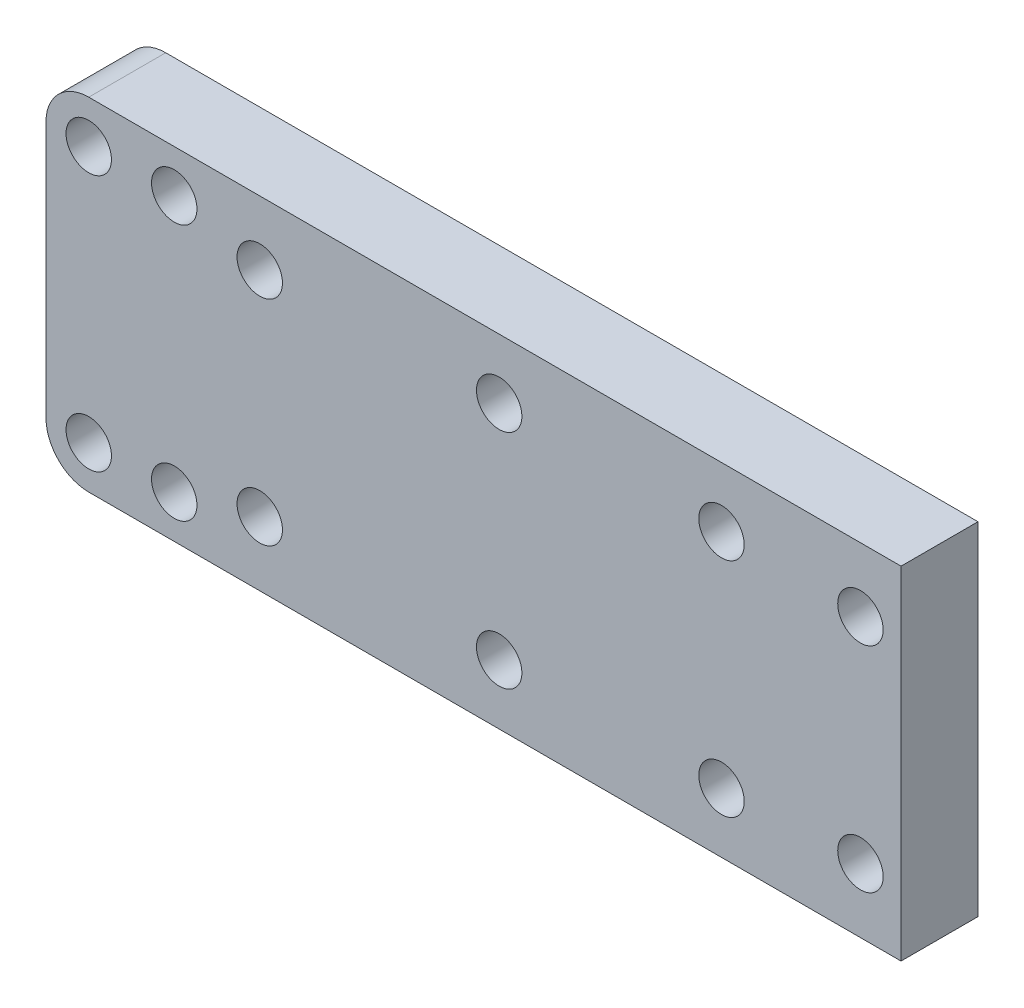
ISO-10303-21;
HEADER;
FILE_DESCRIPTION(('STEP AP214'),'2;1');
FILE_NAME('part.step','',(''),(''),'','','');
FILE_SCHEMA(('AUTOMOTIVE_DESIGN { 1 0 10303 214 1 1 1 1 }'));
ENDSEC;
DATA;
#1=APPLICATION_CONTEXT('core data for automotive mechanical design processes');
#2=APPLICATION_PROTOCOL_DEFINITION('international standard','automotive_design',2000,#1);
#3=PRODUCT_CONTEXT('',#1,'mechanical');
#4=PRODUCT('Part','Part','',(#3));
#5=PRODUCT_RELATED_PRODUCT_CATEGORY('part','',(#4));
#6=PRODUCT_DEFINITION_FORMATION('','',#4);
#7=PRODUCT_DEFINITION_CONTEXT('part definition',#1,'design');
#8=PRODUCT_DEFINITION('design','',#6,#7);
#9=PRODUCT_DEFINITION_SHAPE('','',#8);
#10=(LENGTH_UNIT() NAMED_UNIT(*) SI_UNIT(.MILLI.,.METRE.));
#11=(NAMED_UNIT(*) PLANE_ANGLE_UNIT() SI_UNIT($,.RADIAN.));
#12=(NAMED_UNIT(*) SI_UNIT($,.STERADIAN.) SOLID_ANGLE_UNIT());
#13=UNCERTAINTY_MEASURE_WITH_UNIT(LENGTH_MEASURE(1.E-05),#10,'distance_accuracy_value','');
#14=(GEOMETRIC_REPRESENTATION_CONTEXT(3) GLOBAL_UNCERTAINTY_ASSIGNED_CONTEXT((#13)) GLOBAL_UNIT_ASSIGNED_CONTEXT((#10,
#11,#12)) REPRESENTATION_CONTEXT('',''));
#15=CARTESIAN_POINT('',(0.,0.,0.));
#16=DIRECTION('',(0.,0.,1.));
#17=DIRECTION('',(1.,0.,0.));
#18=AXIS2_PLACEMENT_3D('',#15,#16,#17);
#19=CARTESIAN_POINT('',(-48.1165755919854,24.4284153005464,11.43));
#20=DIRECTION('',(1.,0.,0.));
#21=DIRECTION('',(0.,0.,-1.));
#22=AXIS2_PLACEMENT_3D('',#19,#20,#21);
#23=PLANE('',#22);
#24=DIRECTION('',(0.,-1.,0.));
#25=VECTOR('',#24,1.);
#26=CARTESIAN_POINT('',(-48.1165755919854,24.4284153005464,0.));
#27=LINE('',#26,#25);
#28=CARTESIAN_POINT('',(-48.1165755919854,18.0784153005464,0.));
#29=VERTEX_POINT('',#28);
#30=CARTESIAN_POINT('',(-48.1165755919854,-20.0215846994536,0.));
#31=VERTEX_POINT('',#30);
#32=EDGE_CURVE('E120',#29,#31,#27,.T.);
#33=ORIENTED_EDGE('',*,*,#32,.T.);
#34=DIRECTION('',(0.,0.,-1.));
#35=VECTOR('',#34,1.);
#36=CARTESIAN_POINT('',(-48.1165755919854,-20.0215846994536,11.43));
#37=LINE('',#36,#35);
#38=CARTESIAN_POINT('',(-48.1165755919854,-20.0215846994536,11.43));
#39=VERTEX_POINT('',#38);
#40=EDGE_CURVE('E58',#31,#39,#37,.F.);
#41=ORIENTED_EDGE('',*,*,#40,.T.);
#42=DIRECTION('',(0.,-1.,0.));
#43=VECTOR('',#42,1.);
#44=CARTESIAN_POINT('',(-48.1165755919854,24.4284153005464,11.43));
#45=LINE('',#44,#43);
#46=CARTESIAN_POINT('',(-48.1165755919854,18.0784153005464,11.43));
#47=VERTEX_POINT('',#46);
#48=EDGE_CURVE('E101',#47,#39,#45,.T.);
#49=ORIENTED_EDGE('',*,*,#48,.F.);
#50=DIRECTION('',(0.,0.,-1.));
#51=VECTOR('',#50,1.);
#52=CARTESIAN_POINT('',(-48.1165755919854,18.0784153005464,11.43));
#53=LINE('',#52,#51);
#54=EDGE_CURVE('E134',#47,#29,#53,.T.);
#55=ORIENTED_EDGE('',*,*,#54,.T.);
#56=EDGE_LOOP('',(#33,#41,#49,#55));
#57=FACE_BOUND('',#56,.T.);
#58=ADVANCED_FACE('F37',(#57),#23,.F.);
#59=CARTESIAN_POINT('',(-48.1165755919854,-26.3715846994536,11.43));
#60=DIRECTION('',(0.,1.,0.));
#61=DIRECTION('',(0.,0.,1.));
#62=AXIS2_PLACEMENT_3D('',#59,#60,#61);
#63=PLANE('',#62);
#64=DIRECTION('',(1.,0.,0.));
#65=VECTOR('',#64,1.);
#66=CARTESIAN_POINT('',(-48.1165755919854,-26.3715846994536,11.43));
#67=LINE('',#66,#65);
#68=CARTESIAN_POINT('',(-41.7665755919854,-26.3715846994536,11.43));
#69=VERTEX_POINT('',#68);
#70=CARTESIAN_POINT('',(78.8834244080146,-26.3715846994536,11.43));
#71=VERTEX_POINT('',#70);
#72=EDGE_CURVE('E91',#69,#71,#67,.T.);
#73=ORIENTED_EDGE('',*,*,#72,.F.);
#74=DIRECTION('',(0.,0.,-1.));
#75=VECTOR('',#74,1.);
#76=CARTESIAN_POINT('',(-41.7665755919854,-26.3715846994536,11.43));
#77=LINE('',#76,#75);
#78=CARTESIAN_POINT('',(-41.7665755919854,-26.3715846994536,0.));
#79=VERTEX_POINT('',#78);
#80=EDGE_CURVE('E110',#69,#79,#77,.T.);
#81=ORIENTED_EDGE('',*,*,#80,.T.);
#82=DIRECTION('',(1.,0.,0.));
#83=VECTOR('',#82,1.);
#84=CARTESIAN_POINT('',(-48.1165755919854,-26.3715846994536,0.));
#85=LINE('',#84,#83);
#86=CARTESIAN_POINT('',(78.8834244080146,-26.3715846994536,0.));
#87=VERTEX_POINT('',#86);
#88=EDGE_CURVE('E107',#79,#87,#85,.T.);
#89=ORIENTED_EDGE('',*,*,#88,.T.);
#90=DIRECTION('',(0.,0.,-1.));
#91=VECTOR('',#90,1.);
#92=CARTESIAN_POINT('',(78.8834244080146,-26.3715846994536,11.43));
#93=LINE('',#92,#91);
#94=EDGE_CURVE('E104',#71,#87,#93,.T.);
#95=ORIENTED_EDGE('',*,*,#94,.F.);
#96=EDGE_LOOP('',(#73,#81,#89,#95));
#97=FACE_BOUND('',#96,.T.);
#98=ADVANCED_FACE('F105',(#97),#63,.F.);
#99=CARTESIAN_POINT('',(78.8834244080146,24.4284153005464,11.43));
#100=DIRECTION('',(-1.,0.,0.));
#101=DIRECTION('',(0.,0.,1.));
#102=AXIS2_PLACEMENT_3D('',#99,#100,#101);
#103=PLANE('',#102);
#104=DIRECTION('',(0.,1.,0.));
#105=VECTOR('',#104,1.);
#106=CARTESIAN_POINT('',(78.8834244080146,24.4284153005464,0.));
#107=LINE('',#106,#105);
#108=CARTESIAN_POINT('',(78.8834244080146,24.4284153005464,0.));
#109=VERTEX_POINT('',#108);
#110=EDGE_CURVE('E124',#87,#109,#107,.T.);
#111=ORIENTED_EDGE('',*,*,#110,.T.);
#112=DIRECTION('',(0.,0.,-1.));
#113=VECTOR('',#112,1.);
#114=CARTESIAN_POINT('',(78.8834244080146,24.4284153005464,11.43));
#115=LINE('',#114,#113);
#116=CARTESIAN_POINT('',(78.8834244080146,24.4284153005464,11.43));
#117=VERTEX_POINT('',#116);
#118=EDGE_CURVE('E111',#117,#109,#115,.T.);
#119=ORIENTED_EDGE('',*,*,#118,.F.);
#120=DIRECTION('',(0.,1.,0.));
#121=VECTOR('',#120,1.);
#122=CARTESIAN_POINT('',(78.8834244080146,24.4284153005464,11.43));
#123=LINE('',#122,#121);
#124=EDGE_CURVE('E95',#71,#117,#123,.T.);
#125=ORIENTED_EDGE('',*,*,#124,.F.);
#126=ORIENTED_EDGE('',*,*,#94,.T.);
#127=EDGE_LOOP('',(#111,#119,#125,#126));
#128=FACE_BOUND('',#127,.T.);
#129=ADVANCED_FACE('F113',(#128),#103,.F.);
#130=CARTESIAN_POINT('',(-48.1165755919854,24.4284153005464,11.43));
#131=DIRECTION('',(0.,-1.,0.));
#132=DIRECTION('',(0.,0.,-1.));
#133=AXIS2_PLACEMENT_3D('',#130,#131,#132);
#134=PLANE('',#133);
#135=DIRECTION('',(-1.,0.,0.));
#136=VECTOR('',#135,1.);
#137=CARTESIAN_POINT('',(-48.1165755919854,24.4284153005464,0.));
#138=LINE('',#137,#136);
#139=CARTESIAN_POINT('',(-41.7665755919854,24.4284153005464,0.));
#140=VERTEX_POINT('',#139);
#141=EDGE_CURVE('E126',#109,#140,#138,.T.);
#142=ORIENTED_EDGE('',*,*,#141,.T.);
#143=DIRECTION('',(0.,0.,-1.));
#144=VECTOR('',#143,1.);
#145=CARTESIAN_POINT('',(-41.7665755919854,24.4284153005464,11.43));
#146=LINE('',#145,#144);
#147=CARTESIAN_POINT('',(-41.7665755919854,24.4284153005464,11.43));
#148=VERTEX_POINT('',#147);
#149=EDGE_CURVE('E11',#140,#148,#146,.F.);
#150=ORIENTED_EDGE('',*,*,#149,.T.);
#151=DIRECTION('',(-1.,0.,0.));
#152=VECTOR('',#151,1.);
#153=CARTESIAN_POINT('',(-48.1165755919854,24.4284153005464,11.43));
#154=LINE('',#153,#152);
#155=EDGE_CURVE('E115',#117,#148,#154,.T.);
#156=ORIENTED_EDGE('',*,*,#155,.F.);
#157=ORIENTED_EDGE('',*,*,#118,.T.);
#158=EDGE_LOOP('',(#142,#150,#156,#157));
#159=FACE_BOUND('',#158,.T.);
#160=ADVANCED_FACE('F146',(#159),#134,.F.);
#161=CARTESIAN_POINT('',(0.,0.,11.43));
#162=DIRECTION('',(0.,0.,1.));
#163=DIRECTION('',(1.,0.,0.));
#164=AXIS2_PLACEMENT_3D('',#161,#162,#163);
#165=PLANE('',#164);
#166=CARTESIAN_POINT('',(-29.0665755919854,18.0784153005464,11.43));
#167=DIRECTION('',(0.,0.,-1.));
#168=DIRECTION('',(-1.,0.,0.));
#169=AXIS2_PLACEMENT_3D('',#166,#167,#168);
#170=CIRCLE('',#169,3.37350099999998);
#171=CARTESIAN_POINT('',(-32.4400765919854,18.0784153005464,11.43));
#172=VERTEX_POINT('',#171);
#173=EDGE_CURVE('E228',#172,#172,#170,.T.);
#174=ORIENTED_EDGE('',*,*,#173,.T.);
#175=EDGE_LOOP('',(#174));
#176=FACE_BOUND('',#175,.T.);
#177=CARTESIAN_POINT('',(-41.7665755919854,18.0784153005464,11.43));
#178=DIRECTION('',(0.,0.,-1.));
#179=DIRECTION('',(-1.,0.,0.));
#180=AXIS2_PLACEMENT_3D('',#177,#178,#179);
#181=CIRCLE('',#180,3.37350099999999);
#182=CARTESIAN_POINT('',(-45.1400765919854,18.0784153005464,11.43));
#183=VERTEX_POINT('',#182);
#184=EDGE_CURVE('E237',#183,#183,#181,.T.);
#185=ORIENTED_EDGE('',*,*,#184,.T.);
#186=EDGE_LOOP('',(#185));
#187=FACE_BOUND('',#186,.T.);
#188=CARTESIAN_POINT('',(-41.7665755919854,-20.0215846994536,11.43));
#189=DIRECTION('',(0.,0.,-1.));
#190=DIRECTION('',(-1.,0.,0.));
#191=AXIS2_PLACEMENT_3D('',#188,#189,#190);
#192=CIRCLE('',#191,3.37350099999999);
#193=CARTESIAN_POINT('',(-45.1400765919854,-20.0215846994536,11.43));
#194=VERTEX_POINT('',#193);
#195=EDGE_CURVE('E243',#194,#194,#192,.T.);
#196=ORIENTED_EDGE('',*,*,#195,.T.);
#197=EDGE_LOOP('',(#196));
#198=FACE_BOUND('',#197,.T.);
#199=CARTESIAN_POINT('',(-29.0665755919854,-20.0215846994536,11.43));
#200=DIRECTION('',(0.,0.,-1.));
#201=DIRECTION('',(-1.,0.,0.));
#202=AXIS2_PLACEMENT_3D('',#199,#200,#201);
#203=CIRCLE('',#202,3.37350099999998);
#204=CARTESIAN_POINT('',(-32.4400765919854,-20.0215846994536,11.43));
#205=VERTEX_POINT('',#204);
#206=EDGE_CURVE('E249',#205,#205,#203,.T.);
#207=ORIENTED_EDGE('',*,*,#206,.T.);
#208=EDGE_LOOP('',(#207));
#209=FACE_BOUND('',#208,.T.);
#210=CARTESIAN_POINT('',(72.8509244080146,-16.8465846994536,11.43));
#211=DIRECTION('',(0.,0.,-1.));
#212=DIRECTION('',(-1.,0.,0.));
#213=AXIS2_PLACEMENT_3D('',#210,#211,#212);
#214=CIRCLE('',#213,3.373501);
#215=CARTESIAN_POINT('',(69.4774234080146,-16.8465846994536,11.43));
#216=VERTEX_POINT('',#215);
#217=EDGE_CURVE('E255',#216,#216,#214,.T.);
#218=ORIENTED_EDGE('',*,*,#217,.T.);
#219=EDGE_LOOP('',(#218));
#220=FACE_BOUND('',#219,.T.);
#221=CARTESIAN_POINT('',(72.8509244080146,14.9034153005464,11.43));
#222=DIRECTION('',(0.,0.,-1.));
#223=DIRECTION('',(-1.,0.,0.));
#224=AXIS2_PLACEMENT_3D('',#221,#222,#223);
#225=CIRCLE('',#224,3.373501);
#226=CARTESIAN_POINT('',(69.4774234080146,14.9034153005464,11.43));
#227=VERTEX_POINT('',#226);
#228=EDGE_CURVE('E261',#227,#227,#225,.T.);
#229=ORIENTED_EDGE('',*,*,#228,.T.);
#230=EDGE_LOOP('',(#229));
#231=FACE_BOUND('',#230,.T.);
#232=CARTESIAN_POINT('',(-16.3665755919854,14.9034153005464,11.43));
#233=DIRECTION('',(0.,0.,-1.));
#234=DIRECTION('',(-1.,0.,0.));
#235=AXIS2_PLACEMENT_3D('',#232,#233,#234);
#236=CIRCLE('',#235,3.373501);
#237=CARTESIAN_POINT('',(-19.7400765919854,14.9034153005464,11.43));
#238=VERTEX_POINT('',#237);
#239=EDGE_CURVE('E267',#238,#238,#236,.T.);
#240=ORIENTED_EDGE('',*,*,#239,.T.);
#241=EDGE_LOOP('',(#240));
#242=FACE_BOUND('',#241,.T.);
#243=CARTESIAN_POINT('',(-16.3665755919854,-16.8465846994536,11.43));
#244=DIRECTION('',(0.,0.,-1.));
#245=DIRECTION('',(-1.,0.,0.));
#246=AXIS2_PLACEMENT_3D('',#243,#244,#245);
#247=CIRCLE('',#246,3.373501);
#248=CARTESIAN_POINT('',(-19.7400765919854,-16.8465846994536,11.43));
#249=VERTEX_POINT('',#248);
#250=EDGE_CURVE('E273',#249,#249,#247,.T.);
#251=ORIENTED_EDGE('',*,*,#250,.T.);
#252=EDGE_LOOP('',(#251));
#253=FACE_BOUND('',#252,.T.);
#254=CARTESIAN_POINT('',(52.2134244080146,15.5384153005464,11.43));
#255=DIRECTION('',(0.,0.,-1.));
#256=DIRECTION('',(-1.,0.,0.));
#257=AXIS2_PLACEMENT_3D('',#254,#255,#256);
#258=CIRCLE('',#257,3.373501);
#259=CARTESIAN_POINT('',(48.8399234080146,15.5384153005464,11.43));
#260=VERTEX_POINT('',#259);
#261=EDGE_CURVE('E279',#260,#260,#258,.T.);
#262=ORIENTED_EDGE('',*,*,#261,.T.);
#263=EDGE_LOOP('',(#262));
#264=FACE_BOUND('',#263,.T.);
#265=CARTESIAN_POINT('',(19.1934244080146,15.5384153005464,11.43));
#266=DIRECTION('',(0.,0.,-1.));
#267=DIRECTION('',(-1.,0.,0.));
#268=AXIS2_PLACEMENT_3D('',#265,#266,#267);
#269=CIRCLE('',#268,3.373501);
#270=CARTESIAN_POINT('',(15.8199234080146,15.5384153005464,11.43));
#271=VERTEX_POINT('',#270);
#272=EDGE_CURVE('E285',#271,#271,#269,.T.);
#273=ORIENTED_EDGE('',*,*,#272,.T.);
#274=EDGE_LOOP('',(#273));
#275=FACE_BOUND('',#274,.T.);
#276=CARTESIAN_POINT('',(19.1934244080146,-17.4815846994536,11.43));
#277=DIRECTION('',(0.,0.,-1.));
#278=DIRECTION('',(-1.,0.,0.));
#279=AXIS2_PLACEMENT_3D('',#276,#277,#278);
#280=CIRCLE('',#279,3.373501);
#281=CARTESIAN_POINT('',(15.8199234080146,-17.4815846994536,11.43));
#282=VERTEX_POINT('',#281);
#283=EDGE_CURVE('E291',#282,#282,#280,.T.);
#284=ORIENTED_EDGE('',*,*,#283,.T.);
#285=EDGE_LOOP('',(#284));
#286=FACE_BOUND('',#285,.T.);
#287=CARTESIAN_POINT('',(52.2134244080146,-17.4815846994536,11.43));
#288=DIRECTION('',(0.,0.,-1.));
#289=DIRECTION('',(-1.,0.,0.));
#290=AXIS2_PLACEMENT_3D('',#287,#288,#289);
#291=CIRCLE('',#290,3.373501);
#292=CARTESIAN_POINT('',(48.8399234080146,-17.4815846994536,11.43));
#293=VERTEX_POINT('',#292);
#294=EDGE_CURVE('E122',#293,#293,#291,.T.);
#295=ORIENTED_EDGE('',*,*,#294,.T.);
#296=EDGE_LOOP('',(#295));
#297=FACE_BOUND('',#296,.T.);
#298=ORIENTED_EDGE('',*,*,#48,.T.);
#299=CARTESIAN_POINT('',(-41.7665755919854,-20.0215846994536,11.43));
#300=DIRECTION('',(0.,0.,1.));
#301=DIRECTION('',(1.,0.,0.));
#302=AXIS2_PLACEMENT_3D('',#299,#300,#301);
#303=CIRCLE('',#302,6.35);
#304=EDGE_CURVE('E45',#39,#69,#303,.T.);
#305=ORIENTED_EDGE('',*,*,#304,.T.);
#306=ORIENTED_EDGE('',*,*,#72,.T.);
#307=ORIENTED_EDGE('',*,*,#124,.T.);
#308=ORIENTED_EDGE('',*,*,#155,.T.);
#309=CARTESIAN_POINT('',(-41.7665755919854,18.0784153005464,11.43));
#310=DIRECTION('',(0.,0.,1.));
#311=DIRECTION('',(1.,0.,0.));
#312=AXIS2_PLACEMENT_3D('',#309,#310,#311);
#313=CIRCLE('',#312,6.35);
#314=EDGE_CURVE('E138',#148,#47,#313,.T.);
#315=ORIENTED_EDGE('',*,*,#314,.T.);
#316=EDGE_LOOP('',(#298,#305,#306,#307,#308,#315));
#317=FACE_BOUND('',#316,.T.);
#318=ADVANCED_FACE('F93',(#176,#187,#198,#209,#220,#231,#242,#253,#264,#275,#286,#297,#317),
#165,.T.);
#319=CARTESIAN_POINT('',(0.,0.,0.));
#320=DIRECTION('',(0.,0.,1.));
#321=DIRECTION('',(1.,0.,0.));
#322=AXIS2_PLACEMENT_3D('',#319,#320,#321);
#323=PLANE('',#322);
#324=CARTESIAN_POINT('',(-29.0665755919854,18.0784153005464,0.));
#325=DIRECTION('',(0.,0.,-1.));
#326=DIRECTION('',(-1.,0.,0.));
#327=AXIS2_PLACEMENT_3D('',#324,#325,#326);
#328=CIRCLE('',#327,3.37350099999999);
#329=CARTESIAN_POINT('',(-32.4400765919854,18.0784153005464,0.));
#330=VERTEX_POINT('',#329);
#331=EDGE_CURVE('E230',#330,#330,#328,.T.);
#332=ORIENTED_EDGE('',*,*,#331,.F.);
#333=EDGE_LOOP('',(#332));
#334=FACE_BOUND('',#333,.T.);
#335=CARTESIAN_POINT('',(-41.7665755919854,18.0784153005464,0.));
#336=DIRECTION('',(0.,0.,-1.));
#337=DIRECTION('',(-1.,0.,0.));
#338=AXIS2_PLACEMENT_3D('',#335,#336,#337);
#339=CIRCLE('',#338,3.37350099999999);
#340=CARTESIAN_POINT('',(-45.1400765919854,18.0784153005464,0.));
#341=VERTEX_POINT('',#340);
#342=EDGE_CURVE('E232',#341,#341,#339,.T.);
#343=ORIENTED_EDGE('',*,*,#342,.F.);
#344=EDGE_LOOP('',(#343));
#345=FACE_BOUND('',#344,.T.);
#346=CARTESIAN_POINT('',(-41.7665755919854,-20.0215846994536,0.));
#347=DIRECTION('',(0.,0.,-1.));
#348=DIRECTION('',(-1.,0.,0.));
#349=AXIS2_PLACEMENT_3D('',#346,#347,#348);
#350=CIRCLE('',#349,3.37350099999999);
#351=CARTESIAN_POINT('',(-45.1400765919854,-20.0215846994536,0.));
#352=VERTEX_POINT('',#351);
#353=EDGE_CURVE('E240',#352,#352,#350,.T.);
#354=ORIENTED_EDGE('',*,*,#353,.F.);
#355=EDGE_LOOP('',(#354));
#356=FACE_BOUND('',#355,.T.);
#357=CARTESIAN_POINT('',(-29.0665755919854,-20.0215846994536,0.));
#358=DIRECTION('',(0.,0.,-1.));
#359=DIRECTION('',(-1.,0.,0.));
#360=AXIS2_PLACEMENT_3D('',#357,#358,#359);
#361=CIRCLE('',#360,3.37350099999999);
#362=CARTESIAN_POINT('',(-32.4400765919854,-20.0215846994536,0.));
#363=VERTEX_POINT('',#362);
#364=EDGE_CURVE('E246',#363,#363,#361,.T.);
#365=ORIENTED_EDGE('',*,*,#364,.F.);
#366=EDGE_LOOP('',(#365));
#367=FACE_BOUND('',#366,.T.);
#368=CARTESIAN_POINT('',(72.8509244080146,-16.8465846994536,0.));
#369=DIRECTION('',(0.,0.,-1.));
#370=DIRECTION('',(-1.,0.,0.));
#371=AXIS2_PLACEMENT_3D('',#368,#369,#370);
#372=CIRCLE('',#371,3.373501);
#373=CARTESIAN_POINT('',(69.4774234080146,-16.8465846994536,0.));
#374=VERTEX_POINT('',#373);
#375=EDGE_CURVE('E252',#374,#374,#372,.T.);
#376=ORIENTED_EDGE('',*,*,#375,.F.);
#377=EDGE_LOOP('',(#376));
#378=FACE_BOUND('',#377,.T.);
#379=CARTESIAN_POINT('',(72.8509244080146,14.9034153005464,0.));
#380=DIRECTION('',(0.,0.,-1.));
#381=DIRECTION('',(-1.,0.,0.));
#382=AXIS2_PLACEMENT_3D('',#379,#380,#381);
#383=CIRCLE('',#382,3.373501);
#384=CARTESIAN_POINT('',(69.4774234080146,14.9034153005464,0.));
#385=VERTEX_POINT('',#384);
#386=EDGE_CURVE('E258',#385,#385,#383,.T.);
#387=ORIENTED_EDGE('',*,*,#386,.F.);
#388=EDGE_LOOP('',(#387));
#389=FACE_BOUND('',#388,.T.);
#390=CARTESIAN_POINT('',(-16.3665755919854,14.9034153005464,0.));
#391=DIRECTION('',(0.,0.,-1.));
#392=DIRECTION('',(-1.,0.,0.));
#393=AXIS2_PLACEMENT_3D('',#390,#391,#392);
#394=CIRCLE('',#393,3.373501);
#395=CARTESIAN_POINT('',(-19.7400765919854,14.9034153005464,0.));
#396=VERTEX_POINT('',#395);
#397=EDGE_CURVE('E264',#396,#396,#394,.T.);
#398=ORIENTED_EDGE('',*,*,#397,.F.);
#399=EDGE_LOOP('',(#398));
#400=FACE_BOUND('',#399,.T.);
#401=CARTESIAN_POINT('',(-16.3665755919854,-16.8465846994536,0.));
#402=DIRECTION('',(0.,0.,-1.));
#403=DIRECTION('',(-1.,0.,0.));
#404=AXIS2_PLACEMENT_3D('',#401,#402,#403);
#405=CIRCLE('',#404,3.373501);
#406=CARTESIAN_POINT('',(-19.7400765919854,-16.8465846994536,0.));
#407=VERTEX_POINT('',#406);
#408=EDGE_CURVE('E270',#407,#407,#405,.T.);
#409=ORIENTED_EDGE('',*,*,#408,.F.);
#410=EDGE_LOOP('',(#409));
#411=FACE_BOUND('',#410,.T.);
#412=CARTESIAN_POINT('',(52.2134244080146,15.5384153005464,0.));
#413=DIRECTION('',(0.,0.,-1.));
#414=DIRECTION('',(-1.,0.,0.));
#415=AXIS2_PLACEMENT_3D('',#412,#413,#414);
#416=CIRCLE('',#415,3.37350099999999);
#417=CARTESIAN_POINT('',(48.8399234080146,15.5384153005464,0.));
#418=VERTEX_POINT('',#417);
#419=EDGE_CURVE('E276',#418,#418,#416,.T.);
#420=ORIENTED_EDGE('',*,*,#419,.F.);
#421=EDGE_LOOP('',(#420));
#422=FACE_BOUND('',#421,.T.);
#423=CARTESIAN_POINT('',(19.1934244080146,15.5384153005464,0.));
#424=DIRECTION('',(0.,0.,-1.));
#425=DIRECTION('',(-1.,0.,0.));
#426=AXIS2_PLACEMENT_3D('',#423,#424,#425);
#427=CIRCLE('',#426,3.37350099999999);
#428=CARTESIAN_POINT('',(15.8199234080146,15.5384153005464,0.));
#429=VERTEX_POINT('',#428);
#430=EDGE_CURVE('E282',#429,#429,#427,.T.);
#431=ORIENTED_EDGE('',*,*,#430,.F.);
#432=EDGE_LOOP('',(#431));
#433=FACE_BOUND('',#432,.T.);
#434=CARTESIAN_POINT('',(19.1934244080146,-17.4815846994536,0.));
#435=DIRECTION('',(0.,0.,-1.));
#436=DIRECTION('',(-1.,0.,0.));
#437=AXIS2_PLACEMENT_3D('',#434,#435,#436);
#438=CIRCLE('',#437,3.37350099999999);
#439=CARTESIAN_POINT('',(15.8199234080146,-17.4815846994536,0.));
#440=VERTEX_POINT('',#439);
#441=EDGE_CURVE('E288',#440,#440,#438,.T.);
#442=ORIENTED_EDGE('',*,*,#441,.F.);
#443=EDGE_LOOP('',(#442));
#444=FACE_BOUND('',#443,.T.);
#445=CARTESIAN_POINT('',(52.2134244080146,-17.4815846994536,0.));
#446=DIRECTION('',(0.,0.,-1.));
#447=DIRECTION('',(-1.,0.,0.));
#448=AXIS2_PLACEMENT_3D('',#445,#446,#447);
#449=CIRCLE('',#448,3.37350099999999);
#450=CARTESIAN_POINT('',(48.8399234080146,-17.4815846994536,0.));
#451=VERTEX_POINT('',#450);
#452=EDGE_CURVE('E294',#451,#451,#449,.T.);
#453=ORIENTED_EDGE('',*,*,#452,.F.);
#454=EDGE_LOOP('',(#453));
#455=FACE_BOUND('',#454,.T.);
#456=ORIENTED_EDGE('',*,*,#88,.F.);
#457=CARTESIAN_POINT('',(-41.7665755919854,-20.0215846994536,0.));
#458=DIRECTION('',(0.,0.,1.));
#459=DIRECTION('',(1.,0.,0.));
#460=AXIS2_PLACEMENT_3D('',#457,#458,#459);
#461=CIRCLE('',#460,6.35);
#462=EDGE_CURVE('E132',#79,#31,#461,.F.);
#463=ORIENTED_EDGE('',*,*,#462,.T.);
#464=ORIENTED_EDGE('',*,*,#32,.F.);
#465=CARTESIAN_POINT('',(-41.7665755919854,18.0784153005464,0.));
#466=DIRECTION('',(0.,0.,1.));
#467=DIRECTION('',(1.,0.,0.));
#468=AXIS2_PLACEMENT_3D('',#465,#466,#467);
#469=CIRCLE('',#468,6.35);
#470=EDGE_CURVE('E130',#29,#140,#469,.F.);
#471=ORIENTED_EDGE('',*,*,#470,.T.);
#472=ORIENTED_EDGE('',*,*,#141,.F.);
#473=ORIENTED_EDGE('',*,*,#110,.F.);
#474=EDGE_LOOP('',(#456,#463,#464,#471,#472,#473));
#475=FACE_BOUND('',#474,.T.);
#476=ADVANCED_FACE('F145',(#334,#345,#356,#367,#378,#389,#400,#411,#422,#433,#444,#455,#475),
#323,.F.);
#477=CARTESIAN_POINT('',(-41.7665755919854,-20.0215846994536,11.43));
#478=DIRECTION('',(0.,0.,-1.));
#479=DIRECTION('',(-1.,0.,0.));
#480=AXIS2_PLACEMENT_3D('',#477,#478,#479);
#481=CYLINDRICAL_SURFACE('',#480,6.35);
#482=ORIENTED_EDGE('',*,*,#304,.F.);
#483=ORIENTED_EDGE('',*,*,#40,.F.);
#484=ORIENTED_EDGE('',*,*,#462,.F.);
#485=ORIENTED_EDGE('',*,*,#80,.F.);
#486=EDGE_LOOP('',(#482,#483,#484,#485));
#487=FACE_BOUND('',#486,.T.);
#488=ADVANCED_FACE('F163',(#487),#481,.T.);
#489=CARTESIAN_POINT('',(-41.7665755919854,18.0784153005464,11.43));
#490=DIRECTION('',(0.,0.,-1.));
#491=DIRECTION('',(-1.,0.,0.));
#492=AXIS2_PLACEMENT_3D('',#489,#490,#491);
#493=CYLINDRICAL_SURFACE('',#492,6.35);
#494=ORIENTED_EDGE('',*,*,#314,.F.);
#495=ORIENTED_EDGE('',*,*,#149,.F.);
#496=ORIENTED_EDGE('',*,*,#470,.F.);
#497=ORIENTED_EDGE('',*,*,#54,.F.);
#498=EDGE_LOOP('',(#494,#495,#496,#497));
#499=FACE_BOUND('',#498,.T.);
#500=ADVANCED_FACE('F39',(#499),#493,.T.);
#501=CARTESIAN_POINT('',(52.2134244080146,-17.4815846994536,0.));
#502=DIRECTION('',(0.,0.,-1.));
#503=DIRECTION('',(-1.,0.,0.));
#504=AXIS2_PLACEMENT_3D('',#501,#502,#503);
#505=CYLINDRICAL_SURFACE('',#504,3.37350099999999);
#506=ORIENTED_EDGE('',*,*,#294,.F.);
#507=EDGE_LOOP('',(#506));
#508=FACE_BOUND('',#507,.T.);
#509=ORIENTED_EDGE('',*,*,#452,.T.);
#510=EDGE_LOOP('',(#509));
#511=FACE_BOUND('',#510,.T.);
#512=ADVANCED_FACE('F170',(#508,#511),#505,.F.);
#513=CARTESIAN_POINT('',(19.1934244080146,-17.4815846994536,0.));
#514=DIRECTION('',(0.,0.,-1.));
#515=DIRECTION('',(-1.,0.,0.));
#516=AXIS2_PLACEMENT_3D('',#513,#514,#515);
#517=CYLINDRICAL_SURFACE('',#516,3.37350099999999);
#518=ORIENTED_EDGE('',*,*,#283,.F.);
#519=EDGE_LOOP('',(#518));
#520=FACE_BOUND('',#519,.T.);
#521=ORIENTED_EDGE('',*,*,#441,.T.);
#522=EDGE_LOOP('',(#521));
#523=FACE_BOUND('',#522,.T.);
#524=ADVANCED_FACE('F179',(#520,#523),#517,.F.);
#525=CARTESIAN_POINT('',(19.1934244080146,15.5384153005464,0.));
#526=DIRECTION('',(0.,0.,-1.));
#527=DIRECTION('',(-1.,0.,0.));
#528=AXIS2_PLACEMENT_3D('',#525,#526,#527);
#529=CYLINDRICAL_SURFACE('',#528,3.37350099999999);
#530=ORIENTED_EDGE('',*,*,#272,.F.);
#531=EDGE_LOOP('',(#530));
#532=FACE_BOUND('',#531,.T.);
#533=ORIENTED_EDGE('',*,*,#430,.T.);
#534=EDGE_LOOP('',(#533));
#535=FACE_BOUND('',#534,.T.);
#536=ADVANCED_FACE('F183',(#532,#535),#529,.F.);
#537=CARTESIAN_POINT('',(52.2134244080146,15.5384153005464,0.));
#538=DIRECTION('',(0.,0.,-1.));
#539=DIRECTION('',(-1.,0.,0.));
#540=AXIS2_PLACEMENT_3D('',#537,#538,#539);
#541=CYLINDRICAL_SURFACE('',#540,3.37350099999999);
#542=ORIENTED_EDGE('',*,*,#261,.F.);
#543=EDGE_LOOP('',(#542));
#544=FACE_BOUND('',#543,.T.);
#545=ORIENTED_EDGE('',*,*,#419,.T.);
#546=EDGE_LOOP('',(#545));
#547=FACE_BOUND('',#546,.T.);
#548=ADVANCED_FACE('F187',(#544,#547),#541,.F.);
#549=CARTESIAN_POINT('',(-16.3665755919854,-16.8465846994536,0.));
#550=DIRECTION('',(0.,0.,-1.));
#551=DIRECTION('',(-1.,0.,0.));
#552=AXIS2_PLACEMENT_3D('',#549,#550,#551);
#553=CYLINDRICAL_SURFACE('',#552,3.373501);
#554=ORIENTED_EDGE('',*,*,#250,.F.);
#555=EDGE_LOOP('',(#554));
#556=FACE_BOUND('',#555,.T.);
#557=ORIENTED_EDGE('',*,*,#408,.T.);
#558=EDGE_LOOP('',(#557));
#559=FACE_BOUND('',#558,.T.);
#560=ADVANCED_FACE('F191',(#556,#559),#553,.F.);
#561=CARTESIAN_POINT('',(-16.3665755919854,14.9034153005464,0.));
#562=DIRECTION('',(0.,0.,-1.));
#563=DIRECTION('',(-1.,0.,0.));
#564=AXIS2_PLACEMENT_3D('',#561,#562,#563);
#565=CYLINDRICAL_SURFACE('',#564,3.373501);
#566=ORIENTED_EDGE('',*,*,#239,.F.);
#567=EDGE_LOOP('',(#566));
#568=FACE_BOUND('',#567,.T.);
#569=ORIENTED_EDGE('',*,*,#397,.T.);
#570=EDGE_LOOP('',(#569));
#571=FACE_BOUND('',#570,.T.);
#572=ADVANCED_FACE('F195',(#568,#571),#565,.F.);
#573=CARTESIAN_POINT('',(72.8509244080146,14.9034153005464,0.));
#574=DIRECTION('',(0.,0.,-1.));
#575=DIRECTION('',(-1.,0.,0.));
#576=AXIS2_PLACEMENT_3D('',#573,#574,#575);
#577=CYLINDRICAL_SURFACE('',#576,3.373501);
#578=ORIENTED_EDGE('',*,*,#228,.F.);
#579=EDGE_LOOP('',(#578));
#580=FACE_BOUND('',#579,.T.);
#581=ORIENTED_EDGE('',*,*,#386,.T.);
#582=EDGE_LOOP('',(#581));
#583=FACE_BOUND('',#582,.T.);
#584=ADVANCED_FACE('F199',(#580,#583),#577,.F.);
#585=CARTESIAN_POINT('',(72.8509244080146,-16.8465846994536,0.));
#586=DIRECTION('',(0.,0.,-1.));
#587=DIRECTION('',(-1.,0.,0.));
#588=AXIS2_PLACEMENT_3D('',#585,#586,#587);
#589=CYLINDRICAL_SURFACE('',#588,3.373501);
#590=ORIENTED_EDGE('',*,*,#217,.F.);
#591=EDGE_LOOP('',(#590));
#592=FACE_BOUND('',#591,.T.);
#593=ORIENTED_EDGE('',*,*,#375,.T.);
#594=EDGE_LOOP('',(#593));
#595=FACE_BOUND('',#594,.T.);
#596=ADVANCED_FACE('F203',(#592,#595),#589,.F.);
#597=CARTESIAN_POINT('',(-29.0665755919854,-20.0215846994536,0.));
#598=DIRECTION('',(0.,0.,-1.));
#599=DIRECTION('',(-1.,0.,0.));
#600=AXIS2_PLACEMENT_3D('',#597,#598,#599);
#601=CYLINDRICAL_SURFACE('',#600,3.37350099999999);
#602=ORIENTED_EDGE('',*,*,#206,.F.);
#603=EDGE_LOOP('',(#602));
#604=FACE_BOUND('',#603,.T.);
#605=ORIENTED_EDGE('',*,*,#364,.T.);
#606=EDGE_LOOP('',(#605));
#607=FACE_BOUND('',#606,.T.);
#608=ADVANCED_FACE('F207',(#604,#607),#601,.F.);
#609=CARTESIAN_POINT('',(-41.7665755919854,-20.0215846994536,0.));
#610=DIRECTION('',(0.,0.,-1.));
#611=DIRECTION('',(-1.,0.,0.));
#612=AXIS2_PLACEMENT_3D('',#609,#610,#611);
#613=CYLINDRICAL_SURFACE('',#612,3.37350099999999);
#614=ORIENTED_EDGE('',*,*,#195,.F.);
#615=EDGE_LOOP('',(#614));
#616=FACE_BOUND('',#615,.T.);
#617=ORIENTED_EDGE('',*,*,#353,.T.);
#618=EDGE_LOOP('',(#617));
#619=FACE_BOUND('',#618,.T.);
#620=ADVANCED_FACE('F211',(#616,#619),#613,.F.);
#621=CARTESIAN_POINT('',(-41.7665755919854,18.0784153005464,0.));
#622=DIRECTION('',(0.,0.,-1.));
#623=DIRECTION('',(-1.,0.,0.));
#624=AXIS2_PLACEMENT_3D('',#621,#622,#623);
#625=CYLINDRICAL_SURFACE('',#624,3.37350099999999);
#626=ORIENTED_EDGE('',*,*,#184,.F.);
#627=EDGE_LOOP('',(#626));
#628=FACE_BOUND('',#627,.T.);
#629=ORIENTED_EDGE('',*,*,#342,.T.);
#630=EDGE_LOOP('',(#629));
#631=FACE_BOUND('',#630,.T.);
#632=ADVANCED_FACE('F215',(#628,#631),#625,.F.);
#633=CARTESIAN_POINT('',(-29.0665755919854,18.0784153005464,0.));
#634=DIRECTION('',(0.,0.,-1.));
#635=DIRECTION('',(-1.,0.,0.));
#636=AXIS2_PLACEMENT_3D('',#633,#634,#635);
#637=CYLINDRICAL_SURFACE('',#636,3.37350099999999);
#638=ORIENTED_EDGE('',*,*,#173,.F.);
#639=EDGE_LOOP('',(#638));
#640=FACE_BOUND('',#639,.T.);
#641=ORIENTED_EDGE('',*,*,#331,.T.);
#642=EDGE_LOOP('',(#641));
#643=FACE_BOUND('',#642,.T.);
#644=ADVANCED_FACE('F219',(#640,#643),#637,.F.);
#645=CLOSED_SHELL('',(#58,#98,#129,#160,#318,#476,#488,#500,#512,#524,#536,#548,#560,#572,#584,
#596,#608,#620,#632,#644));
#646=MANIFOLD_SOLID_BREP('B2',#645);
#647=ADVANCED_BREP_SHAPE_REPRESENTATION('',(#18,#646),#14);
#648=SHAPE_DEFINITION_REPRESENTATION(#9,#647);
ENDSEC;
END-ISO-10303-21;
